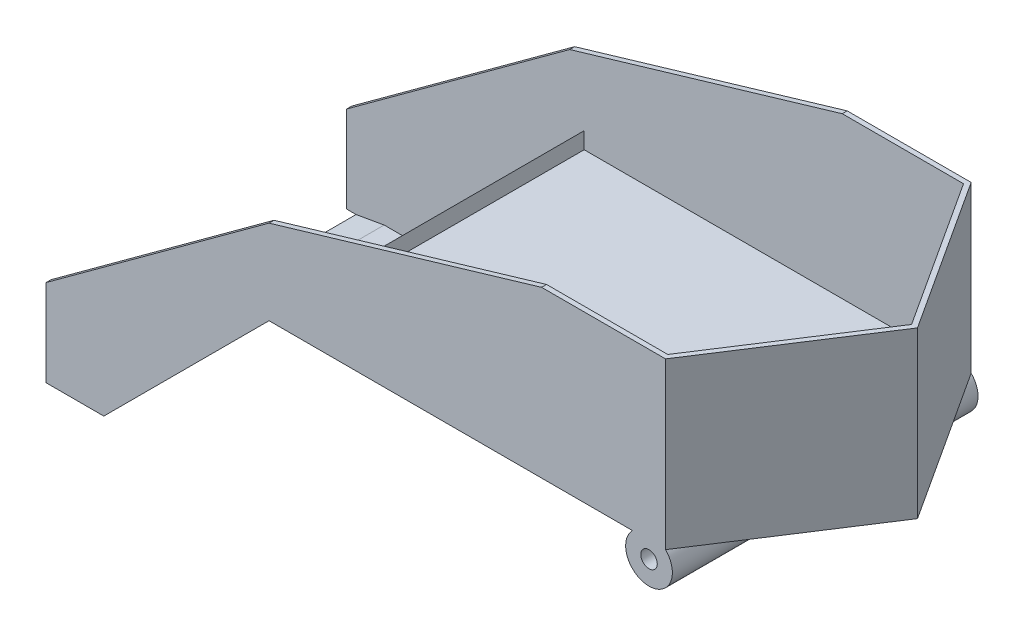
ISO-10303-21;
HEADER;
FILE_DESCRIPTION(('STEP AP214'),'2;1');
FILE_NAME('part.step','',(''),(''),'','','');
FILE_SCHEMA(('AUTOMOTIVE_DESIGN { 1 0 10303 214 1 1 1 1 }'));
ENDSEC;
DATA;
#1=APPLICATION_CONTEXT('core data for automotive mechanical design processes');
#2=APPLICATION_PROTOCOL_DEFINITION('international standard','automotive_design',2000,#1);
#3=PRODUCT_CONTEXT('',#1,'mechanical');
#4=PRODUCT('Part','Part','',(#3));
#5=PRODUCT_RELATED_PRODUCT_CATEGORY('part','',(#4));
#6=PRODUCT_DEFINITION_FORMATION('','',#4);
#7=PRODUCT_DEFINITION_CONTEXT('part definition',#1,'design');
#8=PRODUCT_DEFINITION('design','',#6,#7);
#9=PRODUCT_DEFINITION_SHAPE('','',#8);
#10=(LENGTH_UNIT() NAMED_UNIT(*) SI_UNIT(.MILLI.,.METRE.));
#11=(NAMED_UNIT(*) PLANE_ANGLE_UNIT() SI_UNIT($,.RADIAN.));
#12=(NAMED_UNIT(*) SI_UNIT($,.STERADIAN.) SOLID_ANGLE_UNIT());
#13=UNCERTAINTY_MEASURE_WITH_UNIT(LENGTH_MEASURE(1.E-05),#10,'distance_accuracy_value','');
#14=(GEOMETRIC_REPRESENTATION_CONTEXT(3) GLOBAL_UNCERTAINTY_ASSIGNED_CONTEXT((#13)) GLOBAL_UNIT_ASSIGNED_CONTEXT((#10,
#11,#12)) REPRESENTATION_CONTEXT('',''));
#15=CARTESIAN_POINT('',(0.,0.,0.));
#16=DIRECTION('',(0.,0.,1.));
#17=DIRECTION('',(1.,0.,0.));
#18=AXIS2_PLACEMENT_3D('',#15,#16,#17);
#19=CARTESIAN_POINT('',(0.,100.,-3.));
#20=DIRECTION('',(0.,0.,-1.));
#21=DIRECTION('',(-1.,0.,0.));
#22=AXIS2_PLACEMENT_3D('',#19,#20,#21);
#23=PLANE('',#22);
#24=DIRECTION('',(0.,-1.,0.));
#25=VECTOR('',#24,1.);
#26=CARTESIAN_POINT('',(8.75735931288072,13.,-3.));
#27=LINE('',#26,#25);
#28=CARTESIAN_POINT('',(8.75735931288072,13.,-3.));
#29=VERTEX_POINT('',#28);
#30=CARTESIAN_POINT('',(8.75735931288073,3.,-3.));
#31=VERTEX_POINT('',#30);
#32=EDGE_CURVE('E200',#29,#31,#27,.T.);
#33=ORIENTED_EDGE('',*,*,#32,.F.);
#34=DIRECTION('',(0.707106781186546,0.707106781186549,0.));
#35=VECTOR('',#34,1.);
#36=CARTESIAN_POINT('',(-102.121320343559,-97.8786796564404,-3.));
#37=LINE('',#36,#35);
#38=CARTESIAN_POINT('',(-101.242640687119,-97.,-3.));
#39=VERTEX_POINT('',#38);
#40=EDGE_CURVE('E57',#39,#29,#37,.T.);
#41=ORIENTED_EDGE('',*,*,#40,.F.);
#42=DIRECTION('',(1.,0.,0.));
#43=VECTOR('',#42,1.);
#44=CARTESIAN_POINT('',(-135.,-97.,-3.));
#45=LINE('',#44,#43);
#46=CARTESIAN_POINT('',(-112.314872721528,-97.,-3.));
#47=VERTEX_POINT('',#46);
#48=EDGE_CURVE('E298',#47,#39,#45,.T.);
#49=ORIENTED_EDGE('',*,*,#48,.F.);
#50=DIRECTION('',(-0.984807753012209,-0.173648177666928,0.));
#51=VECTOR('',#50,1.);
#52=CARTESIAN_POINT('',(-112.314872721528,-97.,-2.99999999999995));
#53=LINE('',#52,#51);
#54=CARTESIAN_POINT('',(-129.328718180381,-100.,-3.));
#55=VERTEX_POINT('',#54);
#56=EDGE_CURVE('E50',#47,#55,#53,.T.);
#57=ORIENTED_EDGE('',*,*,#56,.T.);
#58=DIRECTION('',(1.,0.,0.));
#59=VECTOR('',#58,1.);
#60=CARTESIAN_POINT('',(-135.,-100.,-3.));
#61=LINE('',#60,#59);
#62=CARTESIAN_POINT('',(-135.,-100.,-3.00000000000011));
#63=VERTEX_POINT('',#62);
#64=EDGE_CURVE('E294',#63,#55,#61,.T.);
#65=ORIENTED_EDGE('',*,*,#64,.F.);
#66=DIRECTION('',(0.,-1.,0.));
#67=VECTOR('',#66,1.);
#68=CARTESIAN_POINT('',(-135.,-47.5,-3.));
#69=LINE('',#68,#67);
#70=CARTESIAN_POINT('',(-135.,-47.5,-3.));
#71=VERTEX_POINT('',#70);
#72=EDGE_CURVE('E196',#71,#63,#69,.T.);
#73=ORIENTED_EDGE('',*,*,#72,.F.);
#74=DIRECTION('',(-0.807376516489411,-0.590036575664106,0.));
#75=VECTOR('',#74,1.);
#76=CARTESIAN_POINT('',(0.,51.1589727194508,-3.));
#77=LINE('',#76,#75);
#78=CARTESIAN_POINT('',(0.,51.1589727194508,-3.));
#79=VERTEX_POINT('',#78);
#80=EDGE_CURVE('E191',#79,#71,#77,.T.);
#81=ORIENTED_EDGE('',*,*,#80,.F.);
#82=DIRECTION('',(-0.958868255297712,-0.2838514910694,0.));
#83=VECTOR('',#82,1.);
#84=CARTESIAN_POINT('',(13.293364428122,55.0941758022557,-3.));
#85=LINE('',#84,#83);
#86=CARTESIAN_POINT('',(164.988073302028,100.,-3.));
#87=VERTEX_POINT('',#86);
#88=EDGE_CURVE('E193',#87,#79,#85,.T.);
#89=ORIENTED_EDGE('',*,*,#88,.F.);
#90=DIRECTION('',(1.,0.,0.));
#91=VECTOR('',#90,1.);
#92=CARTESIAN_POINT('',(0.,100.,-3.));
#93=LINE('',#92,#91);
#94=CARTESIAN_POINT('',(238.370095610076,100.,-3.));
#95=VERTEX_POINT('',#94);
#96=EDGE_CURVE('E244',#87,#95,#93,.T.);
#97=ORIENTED_EDGE('',*,*,#96,.T.);
#98=DIRECTION('',(0.,-1.,0.));
#99=VECTOR('',#98,1.);
#100=CARTESIAN_POINT('',(238.370095610076,100.,-3.));
#101=LINE('',#100,#99);
#102=CARTESIAN_POINT('',(238.370095610076,3.,-3.));
#103=VERTEX_POINT('',#102);
#104=EDGE_CURVE('E227',#95,#103,#101,.T.);
#105=ORIENTED_EDGE('',*,*,#104,.T.);
#106=DIRECTION('',(1.,0.,0.));
#107=VECTOR('',#106,1.);
#108=CARTESIAN_POINT('',(0.,3.,-3.));
#109=LINE('',#108,#107);
#110=EDGE_CURVE('E208',#31,#103,#109,.T.);
#111=ORIENTED_EDGE('',*,*,#110,.F.);
#112=EDGE_LOOP('',(#33,#41,#49,#57,#65,#73,#81,#89,#97,#105,#111));
#113=FACE_BOUND('',#112,.T.);
#114=ADVANCED_FACE('F41',(#113),#23,.T.);
#115=CARTESIAN_POINT('',(0.,100.,-182.));
#116=DIRECTION('',(0.,0.,1.));
#117=DIRECTION('',(1.,0.,0.));
#118=AXIS2_PLACEMENT_3D('',#115,#116,#117);
#119=PLANE('',#118);
#120=DIRECTION('',(-0.707106781186546,-0.707106781186549,0.));
#121=VECTOR('',#120,1.);
#122=CARTESIAN_POINT('',(-102.121320343559,-97.8786796564404,-182.));
#123=LINE('',#122,#121);
#124=CARTESIAN_POINT('',(8.75735931288072,13.,-182.));
#125=VERTEX_POINT('',#124);
#126=CARTESIAN_POINT('',(-101.242640687119,-97.,-182.));
#127=VERTEX_POINT('',#126);
#128=EDGE_CURVE('E65',#125,#127,#123,.T.);
#129=ORIENTED_EDGE('',*,*,#128,.F.);
#130=DIRECTION('',(0.,1.,0.));
#131=VECTOR('',#130,1.);
#132=CARTESIAN_POINT('',(8.75735931288072,13.,-182.));
#133=LINE('',#132,#131);
#134=CARTESIAN_POINT('',(8.75735931288073,3.,-182.));
#135=VERTEX_POINT('',#134);
#136=EDGE_CURVE('E421',#135,#125,#133,.T.);
#137=ORIENTED_EDGE('',*,*,#136,.F.);
#138=DIRECTION('',(-1.,0.,0.));
#139=VECTOR('',#138,1.);
#140=CARTESIAN_POINT('',(0.,3.,-182.));
#141=LINE('',#140,#139);
#142=CARTESIAN_POINT('',(238.370095610076,3.,-182.));
#143=VERTEX_POINT('',#142);
#144=EDGE_CURVE('E238',#143,#135,#141,.T.);
#145=ORIENTED_EDGE('',*,*,#144,.F.);
#146=DIRECTION('',(0.,-1.,0.));
#147=VECTOR('',#146,1.);
#148=CARTESIAN_POINT('',(238.370095610076,100.,-182.));
#149=LINE('',#148,#147);
#150=CARTESIAN_POINT('',(238.370095610076,100.,-182.));
#151=VERTEX_POINT('',#150);
#152=EDGE_CURVE('E236',#151,#143,#149,.T.);
#153=ORIENTED_EDGE('',*,*,#152,.F.);
#154=DIRECTION('',(-1.,0.,0.));
#155=VECTOR('',#154,1.);
#156=CARTESIAN_POINT('',(0.,100.,-182.));
#157=LINE('',#156,#155);
#158=CARTESIAN_POINT('',(164.988073302028,100.,-182.));
#159=VERTEX_POINT('',#158);
#160=EDGE_CURVE('E241',#151,#159,#157,.T.);
#161=ORIENTED_EDGE('',*,*,#160,.T.);
#162=DIRECTION('',(0.958868255297712,0.2838514910694,0.));
#163=VECTOR('',#162,1.);
#164=CARTESIAN_POINT('',(13.293364428122,55.0941758022557,-182.));
#165=LINE('',#164,#163);
#166=CARTESIAN_POINT('',(0.,51.1589727194508,-182.));
#167=VERTEX_POINT('',#166);
#168=EDGE_CURVE('E283',#167,#159,#165,.T.);
#169=ORIENTED_EDGE('',*,*,#168,.F.);
#170=DIRECTION('',(0.807376516489411,0.590036575664106,0.));
#171=VECTOR('',#170,1.);
#172=CARTESIAN_POINT('',(0.,51.1589727194508,-182.));
#173=LINE('',#172,#171);
#174=CARTESIAN_POINT('',(-135.,-47.5,-182.));
#175=VERTEX_POINT('',#174);
#176=EDGE_CURVE('E316',#175,#167,#173,.T.);
#177=ORIENTED_EDGE('',*,*,#176,.F.);
#178=DIRECTION('',(0.,1.,0.));
#179=VECTOR('',#178,1.);
#180=CARTESIAN_POINT('',(-135.,-47.5,-182.));
#181=LINE('',#180,#179);
#182=CARTESIAN_POINT('',(-135.,-100.,-182.));
#183=VERTEX_POINT('',#182);
#184=EDGE_CURVE('E314',#183,#175,#181,.T.);
#185=ORIENTED_EDGE('',*,*,#184,.F.);
#186=DIRECTION('',(-1.,0.,0.));
#187=VECTOR('',#186,1.);
#188=CARTESIAN_POINT('',(-135.,-100.,-182.));
#189=LINE('',#188,#187);
#190=CARTESIAN_POINT('',(-129.328718180381,-100.,-182.));
#191=VERTEX_POINT('',#190);
#192=EDGE_CURVE('E291',#191,#183,#189,.T.);
#193=ORIENTED_EDGE('',*,*,#192,.F.);
#194=DIRECTION('',(0.984807753012209,0.173648177666928,0.));
#195=VECTOR('',#194,1.);
#196=CARTESIAN_POINT('',(-112.314872721528,-97.,-182.));
#197=LINE('',#196,#195);
#198=CARTESIAN_POINT('',(-112.314872721528,-97.,-182.));
#199=VERTEX_POINT('',#198);
#200=EDGE_CURVE('E11',#191,#199,#197,.T.);
#201=ORIENTED_EDGE('',*,*,#200,.T.);
#202=DIRECTION('',(-1.,0.,0.));
#203=VECTOR('',#202,1.);
#204=CARTESIAN_POINT('',(-135.,-97.,-182.));
#205=LINE('',#204,#203);
#206=EDGE_CURVE('E309',#127,#199,#205,.T.);
#207=ORIENTED_EDGE('',*,*,#206,.F.);
#208=EDGE_LOOP('',(#129,#137,#145,#153,#161,#169,#177,#185,#193,#201,#207));
#209=FACE_BOUND('',#208,.T.);
#210=ADVANCED_FACE('F308',(#209),#119,.T.);
#211=CARTESIAN_POINT('',(0.,3.,0.));
#212=DIRECTION('',(0.,-1.,0.));
#213=DIRECTION('',(0.,0.,-1.));
#214=AXIS2_PLACEMENT_3D('',#211,#212,#213);
#215=PLANE('',#214);
#216=DIRECTION('',(0.,0.,-1.));
#217=VECTOR('',#216,1.);
#218=CARTESIAN_POINT('',(8.75735931288073,3.,11.1421356237309));
#219=LINE('',#218,#217);
#220=EDGE_CURVE('E416',#31,#135,#219,.T.);
#221=ORIENTED_EDGE('',*,*,#220,.F.);
#222=ORIENTED_EDGE('',*,*,#110,.T.);
#223=DIRECTION('',(0.544191105099022,0.,-0.838961287027659));
#224=VECTOR('',#223,1.);
#225=CARTESIAN_POINT('',(166.408566010382,3.,107.940691466194));
#226=LINE('',#225,#224);
#227=CARTESIAN_POINT('',(296.42414966413,3.,-92.5));
#228=VERTEX_POINT('',#227);
#229=EDGE_CURVE('E226',#103,#228,#226,.T.);
#230=ORIENTED_EDGE('',*,*,#229,.T.);
#231=DIRECTION('',(-0.544191105099022,0.,-0.838961287027659));
#232=VECTOR('',#231,1.);
#233=CARTESIAN_POINT('',(250.871290946115,3.,-162.727323856939));
#234=LINE('',#233,#232);
#235=EDGE_CURVE('E233',#228,#143,#234,.T.);
#236=ORIENTED_EDGE('',*,*,#235,.T.);
#237=ORIENTED_EDGE('',*,*,#144,.T.);
#238=EDGE_LOOP('',(#221,#222,#230,#236,#237));
#239=FACE_BOUND('',#238,.T.);
#240=ADVANCED_FACE('F425',(#239),#215,.F.);
#241=CARTESIAN_POINT('',(-135.,-47.5,-387.667301342865));
#242=DIRECTION('',(-1.,0.,0.));
#243=DIRECTION('',(0.,-1.,0.));
#244=AXIS2_PLACEMENT_3D('',#241,#242,#243);
#245=PLANE('',#244);
#246=ORIENTED_EDGE('',*,*,#72,.T.);
#247=DIRECTION('',(0.,0.,1.));
#248=VECTOR('',#247,1.);
#249=CARTESIAN_POINT('',(-135.,-100.,-387.667301342865));
#250=LINE('',#249,#248);
#251=CARTESIAN_POINT('',(-135.,-100.,0.));
#252=VERTEX_POINT('',#251);
#253=EDGE_CURVE('E306',#63,#252,#250,.T.);
#254=ORIENTED_EDGE('',*,*,#253,.T.);
#255=DIRECTION('',(0.,-1.,0.));
#256=VECTOR('',#255,1.);
#257=CARTESIAN_POINT('',(-135.,-47.5,0.));
#258=LINE('',#257,#256);
#259=CARTESIAN_POINT('',(-135.,-47.5,0.));
#260=VERTEX_POINT('',#259);
#261=EDGE_CURVE('E334',#260,#252,#258,.T.);
#262=ORIENTED_EDGE('',*,*,#261,.F.);
#263=DIRECTION('',(0.,0.,1.));
#264=VECTOR('',#263,1.);
#265=CARTESIAN_POINT('',(-135.,-47.5,-387.667301342865));
#266=LINE('',#265,#264);
#267=EDGE_CURVE('E343',#71,#260,#266,.T.);
#268=ORIENTED_EDGE('',*,*,#267,.F.);
#269=EDGE_LOOP('',(#246,#254,#262,#268));
#270=FACE_BOUND('',#269,.T.);
#271=ADVANCED_FACE('F427',(#270),#245,.T.);
#272=CARTESIAN_POINT('',(0.,51.1589727194508,-387.667301342865));
#273=DIRECTION('',(-0.590036575664106,0.807376516489411,0.));
#274=DIRECTION('',(-0.807376516489411,-0.590036575664106,0.));
#275=AXIS2_PLACEMENT_3D('',#272,#273,#274);
#276=PLANE('',#275);
#277=ORIENTED_EDGE('',*,*,#176,.T.);
#278=DIRECTION('',(0.,0.,1.));
#279=VECTOR('',#278,1.);
#280=CARTESIAN_POINT('',(0.,51.1589727194508,-185.));
#281=LINE('',#280,#279);
#282=CARTESIAN_POINT('',(0.,51.1589727194508,-185.));
#283=VERTEX_POINT('',#282);
#284=EDGE_CURVE('E215',#283,#167,#281,.T.);
#285=ORIENTED_EDGE('',*,*,#284,.F.);
#286=DIRECTION('',(0.807376516489411,0.590036575664106,0.));
#287=VECTOR('',#286,1.);
#288=CARTESIAN_POINT('',(0.,51.1589727194508,-185.));
#289=LINE('',#288,#287);
#290=CARTESIAN_POINT('',(-135.,-47.5,-185.));
#291=VERTEX_POINT('',#290);
#292=EDGE_CURVE('E332',#291,#283,#289,.T.);
#293=ORIENTED_EDGE('',*,*,#292,.F.);
#294=EDGE_CURVE('E348',#291,#175,#266,.T.);
#295=ORIENTED_EDGE('',*,*,#294,.T.);
#296=EDGE_LOOP('',(#277,#285,#293,#295));
#297=FACE_BOUND('',#296,.T.);
#298=ADVANCED_FACE('F434',(#297),#276,.T.);
#299=CARTESIAN_POINT('',(-135.,-100.,-185.));
#300=VERTEX_POINT('',#299);
#301=EDGE_CURVE('E345',#300,#183,#250,.T.);
#302=ORIENTED_EDGE('',*,*,#301,.T.);
#303=ORIENTED_EDGE('',*,*,#184,.T.);
#304=ORIENTED_EDGE('',*,*,#294,.F.);
#305=DIRECTION('',(0.,1.,0.));
#306=VECTOR('',#305,1.);
#307=CARTESIAN_POINT('',(-135.,-47.5,-185.));
#308=LINE('',#307,#306);
#309=EDGE_CURVE('E325',#300,#291,#308,.T.);
#310=ORIENTED_EDGE('',*,*,#309,.F.);
#311=EDGE_LOOP('',(#302,#303,#304,#310));
#312=FACE_BOUND('',#311,.T.);
#313=ADVANCED_FACE('F437',(#312),#245,.T.);
#314=CARTESIAN_POINT('',(0.,51.1589727194508,0.));
#315=VERTEX_POINT('',#314);
#316=EDGE_CURVE('E204',#79,#315,#281,.T.);
#317=ORIENTED_EDGE('',*,*,#316,.F.);
#318=ORIENTED_EDGE('',*,*,#80,.T.);
#319=ORIENTED_EDGE('',*,*,#267,.T.);
#320=DIRECTION('',(-0.807376516489411,-0.590036575664106,0.));
#321=VECTOR('',#320,1.);
#322=CARTESIAN_POINT('',(0.,51.1589727194508,0.));
#323=LINE('',#322,#321);
#324=EDGE_CURVE('E214',#315,#260,#323,.T.);
#325=ORIENTED_EDGE('',*,*,#324,.F.);
#326=EDGE_LOOP('',(#317,#318,#319,#325));
#327=FACE_BOUND('',#326,.T.);
#328=ADVANCED_FACE('F212',(#327),#276,.T.);
#329=CARTESIAN_POINT('',(0.,0.,0.));
#330=DIRECTION('',(0.,-1.,0.));
#331=DIRECTION('',(0.,0.,-1.));
#332=AXIS2_PLACEMENT_3D('',#329,#330,#331);
#333=PLANE('',#332);
#334=DIRECTION('',(0.,0.,1.));
#335=VECTOR('',#334,1.);
#336=CARTESIAN_POINT('',(240.,0.,-222.18659318188));
#337=LINE('',#336,#335);
#338=CARTESIAN_POINT('',(240.,0.,-185.));
#339=VERTEX_POINT('',#338);
#340=CARTESIAN_POINT('',(240.,0.,0.));
#341=VERTEX_POINT('',#340);
#342=EDGE_CURVE('E364',#339,#341,#337,.T.);
#343=ORIENTED_EDGE('',*,*,#342,.F.);
#344=DIRECTION('',(-0.544191105099022,0.,-0.838961287027659));
#345=VECTOR('',#344,1.);
#346=CARTESIAN_POINT('',(240.,0.,-185.));
#347=LINE('',#346,#345);
#348=CARTESIAN_POINT('',(300.,0.,-92.5));
#349=VERTEX_POINT('',#348);
#350=EDGE_CURVE('E271',#349,#339,#347,.T.);
#351=ORIENTED_EDGE('',*,*,#350,.F.);
#352=DIRECTION('',(0.544191105099022,0.,-0.838961287027659));
#353=VECTOR('',#352,1.);
#354=CARTESIAN_POINT('',(300.,0.,-92.5));
#355=LINE('',#354,#353);
#356=EDGE_CURVE('E269',#341,#349,#355,.T.);
#357=ORIENTED_EDGE('',*,*,#356,.F.);
#358=EDGE_LOOP('',(#343,#351,#357));
#359=FACE_BOUND('',#358,.T.);
#360=ADVANCED_FACE('F474',(#359),#333,.T.);
#361=CARTESIAN_POINT('',(0.,100.,0.));
#362=DIRECTION('',(0.,-1.,0.));
#363=DIRECTION('',(0.,0.,-1.));
#364=AXIS2_PLACEMENT_3D('',#361,#362,#363);
#365=PLANE('',#364);
#366=DIRECTION('',(-1.,0.,0.));
#367=VECTOR('',#366,1.);
#368=CARTESIAN_POINT('',(0.,100.,-185.));
#369=LINE('',#368,#367);
#370=CARTESIAN_POINT('',(240.,100.,-185.));
#371=VERTEX_POINT('',#370);
#372=CARTESIAN_POINT('',(164.988073302028,100.,-185.));
#373=VERTEX_POINT('',#372);
#374=EDGE_CURVE('E260',#371,#373,#369,.T.);
#375=ORIENTED_EDGE('',*,*,#374,.T.);
#376=DIRECTION('',(0.,0.,1.));
#377=VECTOR('',#376,1.);
#378=CARTESIAN_POINT('',(164.988073302028,100.,-185.));
#379=LINE('',#378,#377);
#380=EDGE_CURVE('E209',#373,#159,#379,.T.);
#381=ORIENTED_EDGE('',*,*,#380,.T.);
#382=ORIENTED_EDGE('',*,*,#160,.F.);
#383=DIRECTION('',(-0.544191105099022,0.,-0.838961287027659));
#384=VECTOR('',#383,1.);
#385=CARTESIAN_POINT('',(250.871290946115,100.,-162.727323856939));
#386=LINE('',#385,#384);
#387=CARTESIAN_POINT('',(296.42414966413,100.,-92.5));
#388=VERTEX_POINT('',#387);
#389=EDGE_CURVE('E248',#388,#151,#386,.T.);
#390=ORIENTED_EDGE('',*,*,#389,.F.);
#391=DIRECTION('',(0.544191105099022,0.,-0.838961287027659));
#392=VECTOR('',#391,1.);
#393=CARTESIAN_POINT('',(166.408566010382,100.,107.940691466194));
#394=LINE('',#393,#392);
#395=EDGE_CURVE('E246',#95,#388,#394,.T.);
#396=ORIENTED_EDGE('',*,*,#395,.F.);
#397=ORIENTED_EDGE('',*,*,#96,.F.);
#398=CARTESIAN_POINT('',(164.988073302028,100.,0.));
#399=VERTEX_POINT('',#398);
#400=EDGE_CURVE('E207',#87,#399,#379,.T.);
#401=ORIENTED_EDGE('',*,*,#400,.T.);
#402=DIRECTION('',(1.,0.,0.));
#403=VECTOR('',#402,1.);
#404=CARTESIAN_POINT('',(0.,100.,0.));
#405=LINE('',#404,#403);
#406=CARTESIAN_POINT('',(240.,100.,0.));
#407=VERTEX_POINT('',#406);
#408=EDGE_CURVE('E253',#399,#407,#405,.T.);
#409=ORIENTED_EDGE('',*,*,#408,.T.);
#410=DIRECTION('',(0.544191105099022,0.,-0.838961287027659));
#411=VECTOR('',#410,1.);
#412=CARTESIAN_POINT('',(300.,100.,-92.5));
#413=LINE('',#412,#411);
#414=CARTESIAN_POINT('',(300.,100.,-92.5));
#415=VERTEX_POINT('',#414);
#416=EDGE_CURVE('E255',#407,#415,#413,.T.);
#417=ORIENTED_EDGE('',*,*,#416,.T.);
#418=DIRECTION('',(-0.544191105099022,0.,-0.838961287027659));
#419=VECTOR('',#418,1.);
#420=CARTESIAN_POINT('',(240.,100.,-185.));
#421=LINE('',#420,#419);
#422=EDGE_CURVE('E258',#415,#371,#421,.T.);
#423=ORIENTED_EDGE('',*,*,#422,.T.);
#424=EDGE_LOOP('',(#375,#381,#382,#390,#396,#397,#401,#409,#417,#423));
#425=FACE_BOUND('',#424,.T.);
#426=ADVANCED_FACE('F372',(#425),#365,.F.);
#427=CARTESIAN_POINT('',(0.,100.,0.));
#428=DIRECTION('',(0.,0.,-1.));
#429=DIRECTION('',(-1.,0.,0.));
#430=AXIS2_PLACEMENT_3D('',#427,#428,#429);
#431=PLANE('',#430);
#432=ORIENTED_EDGE('',*,*,#408,.F.);
#433=DIRECTION('',(0.958868255297712,0.2838514910694,0.));
#434=VECTOR('',#433,1.);
#435=CARTESIAN_POINT('',(0.,51.1589727194508,0.));
#436=LINE('',#435,#434);
#437=EDGE_CURVE('E220',#315,#399,#436,.T.);
#438=ORIENTED_EDGE('',*,*,#437,.F.);
#439=ORIENTED_EDGE('',*,*,#324,.T.);
#440=ORIENTED_EDGE('',*,*,#261,.T.);
#441=DIRECTION('',(1.,0.,0.));
#442=VECTOR('',#441,1.);
#443=CARTESIAN_POINT('',(-135.,-100.,0.));
#444=LINE('',#443,#442);
#445=CARTESIAN_POINT('',(-99.9999999999996,-100.,0.));
#446=VERTEX_POINT('',#445);
#447=EDGE_CURVE('E337',#252,#446,#444,.T.);
#448=ORIENTED_EDGE('',*,*,#447,.T.);
#449=DIRECTION('',(0.707106781186546,0.707106781186549,0.));
#450=VECTOR('',#449,1.);
#451=CARTESIAN_POINT('',(-99.9999999999996,-100.,0.));
#452=LINE('',#451,#450);
#453=CARTESIAN_POINT('',(0.,0.,0.));
#454=VERTEX_POINT('',#453);
#455=EDGE_CURVE('E340',#446,#454,#452,.T.);
#456=ORIENTED_EDGE('',*,*,#455,.T.);
#457=DIRECTION('',(1.,0.,0.));
#458=VECTOR('',#457,1.);
#459=CARTESIAN_POINT('',(0.,0.,0.));
#460=LINE('',#459,#458);
#461=CARTESIAN_POINT('',(220.,0.,0.));
#462=VERTEX_POINT('',#461);
#463=EDGE_CURVE('E266',#454,#462,#460,.T.);
#464=ORIENTED_EDGE('',*,*,#463,.T.);
#465=CARTESIAN_POINT('',(230.,-9.99999999999999,0.));
#466=DIRECTION('',(0.,0.,1.));
#467=DIRECTION('',(-1.,0.,0.));
#468=AXIS2_PLACEMENT_3D('',#465,#466,#467);
#469=CIRCLE('',#468,14.142135623731);
#470=EDGE_CURVE('E361',#462,#341,#469,.T.);
#471=ORIENTED_EDGE('',*,*,#470,.T.);
#472=DIRECTION('',(0.,-1.,0.));
#473=VECTOR('',#472,1.);
#474=CARTESIAN_POINT('',(240.,100.,0.));
#475=LINE('',#474,#473);
#476=EDGE_CURVE('E280',#407,#341,#475,.T.);
#477=ORIENTED_EDGE('',*,*,#476,.F.);
#478=EDGE_LOOP('',(#432,#438,#439,#440,#448,#456,#464,#471,#477));
#479=FACE_BOUND('',#478,.T.);
#480=CARTESIAN_POINT('',(230.,-9.99999999999999,0.));
#481=DIRECTION('',(0.,0.,1.));
#482=DIRECTION('',(1.,0.,0.));
#483=AXIS2_PLACEMENT_3D('',#480,#481,#482);
#484=CIRCLE('',#483,4.99999999999999);
#485=CARTESIAN_POINT('',(235.,-9.99999999999999,0.));
#486=VERTEX_POINT('',#485);
#487=EDGE_CURVE('E353',#486,#486,#484,.T.);
#488=ORIENTED_EDGE('',*,*,#487,.F.);
#489=EDGE_LOOP('',(#488));
#490=FACE_BOUND('',#489,.T.);
#491=ADVANCED_FACE('F375',(#479,#490),#431,.F.);
#492=CARTESIAN_POINT('',(300.,100.,-92.5));
#493=DIRECTION('',(-0.838961287027659,0.,-0.544191105099022));
#494=DIRECTION('',(-0.544191105099022,0.,0.838961287027659));
#495=AXIS2_PLACEMENT_3D('',#492,#493,#494);
#496=PLANE('',#495);
#497=ORIENTED_EDGE('',*,*,#356,.T.);
#498=DIRECTION('',(0.,-1.,0.));
#499=VECTOR('',#498,1.);
#500=CARTESIAN_POINT('',(300.,100.,-92.5));
#501=LINE('',#500,#499);
#502=EDGE_CURVE('E277',#415,#349,#501,.T.);
#503=ORIENTED_EDGE('',*,*,#502,.F.);
#504=ORIENTED_EDGE('',*,*,#416,.F.);
#505=ORIENTED_EDGE('',*,*,#476,.T.);
#506=EDGE_LOOP('',(#497,#503,#504,#505));
#507=FACE_BOUND('',#506,.T.);
#508=ADVANCED_FACE('F381',(#507),#496,.F.);
#509=CARTESIAN_POINT('',(240.,100.,-185.));
#510=DIRECTION('',(-0.838961287027659,0.,0.544191105099022));
#511=DIRECTION('',(0.544191105099022,0.,0.838961287027659));
#512=AXIS2_PLACEMENT_3D('',#509,#510,#511);
#513=PLANE('',#512);
#514=ORIENTED_EDGE('',*,*,#350,.T.);
#515=DIRECTION('',(0.,-1.,0.));
#516=VECTOR('',#515,1.);
#517=CARTESIAN_POINT('',(240.,100.,-185.));
#518=LINE('',#517,#516);
#519=EDGE_CURVE('E263',#371,#339,#518,.T.);
#520=ORIENTED_EDGE('',*,*,#519,.F.);
#521=ORIENTED_EDGE('',*,*,#422,.F.);
#522=ORIENTED_EDGE('',*,*,#502,.T.);
#523=EDGE_LOOP('',(#514,#520,#521,#522));
#524=FACE_BOUND('',#523,.T.);
#525=ADVANCED_FACE('F387',(#524),#513,.F.);
#526=CARTESIAN_POINT('',(0.,100.,-185.));
#527=DIRECTION('',(0.,0.,1.));
#528=DIRECTION('',(1.,0.,0.));
#529=AXIS2_PLACEMENT_3D('',#526,#527,#528);
#530=PLANE('',#529);
#531=DIRECTION('',(-1.,0.,0.));
#532=VECTOR('',#531,1.);
#533=CARTESIAN_POINT('',(0.,0.,-185.));
#534=LINE('',#533,#532);
#535=CARTESIAN_POINT('',(220.,0.,-185.));
#536=VERTEX_POINT('',#535);
#537=CARTESIAN_POINT('',(0.,0.,-185.));
#538=VERTEX_POINT('',#537);
#539=EDGE_CURVE('E256',#536,#538,#534,.T.);
#540=ORIENTED_EDGE('',*,*,#539,.T.);
#541=DIRECTION('',(-0.707106781186546,-0.707106781186549,0.));
#542=VECTOR('',#541,1.);
#543=CARTESIAN_POINT('',(-99.9999999999996,-100.,-185.));
#544=LINE('',#543,#542);
#545=CARTESIAN_POINT('',(-99.9999999999996,-100.,-185.));
#546=VERTEX_POINT('',#545);
#547=EDGE_CURVE('E330',#538,#546,#544,.T.);
#548=ORIENTED_EDGE('',*,*,#547,.T.);
#549=DIRECTION('',(-1.,0.,0.));
#550=VECTOR('',#549,1.);
#551=CARTESIAN_POINT('',(-135.,-100.,-185.));
#552=LINE('',#551,#550);
#553=EDGE_CURVE('E327',#546,#300,#552,.T.);
#554=ORIENTED_EDGE('',*,*,#553,.T.);
#555=ORIENTED_EDGE('',*,*,#309,.T.);
#556=ORIENTED_EDGE('',*,*,#292,.T.);
#557=DIRECTION('',(0.958868255297712,0.2838514910694,0.));
#558=VECTOR('',#557,1.);
#559=CARTESIAN_POINT('',(0.,51.1589727194508,-185.));
#560=LINE('',#559,#558);
#561=EDGE_CURVE('E216',#283,#373,#560,.T.);
#562=ORIENTED_EDGE('',*,*,#561,.T.);
#563=ORIENTED_EDGE('',*,*,#374,.F.);
#564=ORIENTED_EDGE('',*,*,#519,.T.);
#565=CARTESIAN_POINT('',(230.,-9.99999999999999,-185.));
#566=DIRECTION('',(0.,0.,1.));
#567=DIRECTION('',(1.,0.,0.));
#568=AXIS2_PLACEMENT_3D('',#565,#566,#567);
#569=CIRCLE('',#568,14.142135623731);
#570=EDGE_CURVE('E354',#339,#536,#569,.F.);
#571=ORIENTED_EDGE('',*,*,#570,.T.);
#572=EDGE_LOOP('',(#540,#548,#554,#555,#556,#562,#563,#564,#571));
#573=FACE_BOUND('',#572,.T.);
#574=CARTESIAN_POINT('',(230.,-9.99999999999999,-185.));
#575=DIRECTION('',(0.,0.,1.));
#576=DIRECTION('',(1.,0.,0.));
#577=AXIS2_PLACEMENT_3D('',#574,#575,#576);
#578=CIRCLE('',#577,4.99999999999999);
#579=CARTESIAN_POINT('',(235.,-9.99999999999999,-185.));
#580=VERTEX_POINT('',#579);
#581=EDGE_CURVE('E357',#580,#580,#578,.F.);
#582=ORIENTED_EDGE('',*,*,#581,.F.);
#583=EDGE_LOOP('',(#582));
#584=FACE_BOUND('',#583,.T.);
#585=ADVANCED_FACE('F390',(#573,#584),#530,.F.);
#586=DIRECTION('',(0.,0.,1.));
#587=VECTOR('',#586,1.);
#588=CARTESIAN_POINT('',(220.,0.,-222.18659318188));
#589=LINE('',#588,#587);
#590=EDGE_CURVE('E358',#536,#462,#589,.T.);
#591=ORIENTED_EDGE('',*,*,#590,.T.);
#592=ORIENTED_EDGE('',*,*,#463,.F.);
#593=DIRECTION('',(0.,0.,1.));
#594=VECTOR('',#593,1.);
#595=CARTESIAN_POINT('',(0.,0.,0.));
#596=LINE('',#595,#594);
#597=EDGE_CURVE('E230',#538,#454,#596,.T.);
#598=ORIENTED_EDGE('',*,*,#597,.F.);
#599=ORIENTED_EDGE('',*,*,#539,.F.);
#600=EDGE_LOOP('',(#591,#592,#598,#599));
#601=FACE_BOUND('',#600,.T.);
#602=ADVANCED_FACE('F450',(#601),#333,.T.);
#603=CARTESIAN_POINT('',(297.483116138917,100.,-94.1325733152971));
#604=DIRECTION('',(-0.838961287027659,0.,-0.544191105099022));
#605=DIRECTION('',(-0.544191105099022,0.,0.838961287027659));
#606=AXIS2_PLACEMENT_3D('',#603,#604,#605);
#607=PLANE('',#606);
#608=ORIENTED_EDGE('',*,*,#229,.F.);
#609=ORIENTED_EDGE('',*,*,#104,.F.);
#610=ORIENTED_EDGE('',*,*,#395,.T.);
#611=DIRECTION('',(0.,-1.,0.));
#612=VECTOR('',#611,1.);
#613=CARTESIAN_POINT('',(296.42414966413,100.,-92.5));
#614=LINE('',#613,#612);
#615=EDGE_CURVE('E231',#388,#228,#614,.T.);
#616=ORIENTED_EDGE('',*,*,#615,.T.);
#617=EDGE_LOOP('',(#608,#609,#610,#616));
#618=FACE_BOUND('',#617,.T.);
#619=ADVANCED_FACE('F407',(#618),#607,.T.);
#620=CARTESIAN_POINT('',(237.483116138917,100.,-183.367426684703));
#621=DIRECTION('',(-0.838961287027659,0.,0.544191105099022));
#622=DIRECTION('',(0.544191105099022,0.,0.838961287027659));
#623=AXIS2_PLACEMENT_3D('',#620,#621,#622);
#624=PLANE('',#623);
#625=ORIENTED_EDGE('',*,*,#235,.F.);
#626=ORIENTED_EDGE('',*,*,#615,.F.);
#627=ORIENTED_EDGE('',*,*,#389,.T.);
#628=ORIENTED_EDGE('',*,*,#152,.T.);
#629=EDGE_LOOP('',(#625,#626,#627,#628));
#630=FACE_BOUND('',#629,.T.);
#631=ADVANCED_FACE('F403',(#630),#624,.T.);
#632=CARTESIAN_POINT('',(0.,51.1589727194508,-185.));
#633=DIRECTION('',(0.2838514910694,-0.958868255297712,0.));
#634=DIRECTION('',(0.958868255297712,0.2838514910694,0.));
#635=AXIS2_PLACEMENT_3D('',#632,#633,#634);
#636=PLANE('',#635);
#637=ORIENTED_EDGE('',*,*,#168,.T.);
#638=ORIENTED_EDGE('',*,*,#380,.F.);
#639=ORIENTED_EDGE('',*,*,#561,.F.);
#640=ORIENTED_EDGE('',*,*,#284,.T.);
#641=EDGE_LOOP('',(#637,#638,#639,#640));
#642=FACE_BOUND('',#641,.T.);
#643=ADVANCED_FACE('F395',(#642),#636,.F.);
#644=ORIENTED_EDGE('',*,*,#88,.T.);
#645=ORIENTED_EDGE('',*,*,#316,.T.);
#646=ORIENTED_EDGE('',*,*,#437,.T.);
#647=ORIENTED_EDGE('',*,*,#400,.F.);
#648=EDGE_LOOP('',(#644,#645,#646,#647));
#649=FACE_BOUND('',#648,.T.);
#650=ADVANCED_FACE('F203',(#649),#636,.F.);
#651=CARTESIAN_POINT('',(230.,-9.99999999999999,-222.18659318188));
#652=DIRECTION('',(0.,0.,1.));
#653=DIRECTION('',(1.,0.,0.));
#654=AXIS2_PLACEMENT_3D('',#651,#652,#653);
#655=CYLINDRICAL_SURFACE('',#654,14.142135623731);
#656=ORIENTED_EDGE('',*,*,#570,.F.);
#657=ORIENTED_EDGE('',*,*,#342,.T.);
#658=ORIENTED_EDGE('',*,*,#470,.F.);
#659=ORIENTED_EDGE('',*,*,#590,.F.);
#660=EDGE_LOOP('',(#656,#657,#658,#659));
#661=FACE_BOUND('',#660,.T.);
#662=ADVANCED_FACE('F460',(#661),#655,.T.);
#663=CARTESIAN_POINT('',(230.,-9.99999999999999,-222.18659318188));
#664=DIRECTION('',(0.,0.,1.));
#665=DIRECTION('',(1.,0.,0.));
#666=AXIS2_PLACEMENT_3D('',#663,#664,#665);
#667=CYLINDRICAL_SURFACE('',#666,4.99999999999999);
#668=ORIENTED_EDGE('',*,*,#581,.T.);
#669=EDGE_LOOP('',(#668));
#670=FACE_BOUND('',#669,.T.);
#671=ORIENTED_EDGE('',*,*,#487,.T.);
#672=EDGE_LOOP('',(#671));
#673=FACE_BOUND('',#672,.T.);
#674=ADVANCED_FACE('F464',(#670,#673),#667,.F.);
#675=CARTESIAN_POINT('',(-99.9999999999996,-100.,-387.667301342865));
#676=DIRECTION('',(0.707106781186549,-0.707106781186546,0.));
#677=DIRECTION('',(0.707106781186546,0.707106781186549,0.));
#678=AXIS2_PLACEMENT_3D('',#675,#676,#677);
#679=PLANE('',#678);
#680=ORIENTED_EDGE('',*,*,#547,.F.);
#681=ORIENTED_EDGE('',*,*,#597,.T.);
#682=ORIENTED_EDGE('',*,*,#455,.F.);
#683=DIRECTION('',(0.,0.,1.));
#684=VECTOR('',#683,1.);
#685=CARTESIAN_POINT('',(-99.9999999999996,-100.,-387.667301342865));
#686=LINE('',#685,#684);
#687=EDGE_CURVE('E328',#546,#446,#686,.T.);
#688=ORIENTED_EDGE('',*,*,#687,.F.);
#689=EDGE_LOOP('',(#680,#681,#682,#688));
#690=FACE_BOUND('',#689,.T.);
#691=ADVANCED_FACE('F470',(#690),#679,.T.);
#692=CARTESIAN_POINT('',(-135.,-100.,-387.667301342865));
#693=DIRECTION('',(0.,-1.,0.));
#694=DIRECTION('',(1.,0.,0.));
#695=AXIS2_PLACEMENT_3D('',#692,#693,#694);
#696=PLANE('',#695);
#697=ORIENTED_EDGE('',*,*,#253,.F.);
#698=ORIENTED_EDGE('',*,*,#64,.T.);
#699=DIRECTION('',(0.,0.,-1.));
#700=VECTOR('',#699,1.);
#701=CARTESIAN_POINT('',(-129.328718180381,-100.,-387.667301342865));
#702=LINE('',#701,#700);
#703=EDGE_CURVE('E288',#55,#191,#702,.T.);
#704=ORIENTED_EDGE('',*,*,#703,.T.);
#705=ORIENTED_EDGE('',*,*,#192,.T.);
#706=ORIENTED_EDGE('',*,*,#301,.F.);
#707=ORIENTED_EDGE('',*,*,#553,.F.);
#708=ORIENTED_EDGE('',*,*,#687,.T.);
#709=ORIENTED_EDGE('',*,*,#447,.F.);
#710=EDGE_LOOP('',(#697,#698,#704,#705,#706,#707,#708,#709));
#711=FACE_BOUND('',#710,.T.);
#712=ADVANCED_FACE('F303',(#711),#696,.T.);
#713=CARTESIAN_POINT('',(-102.121320343559,-97.8786796564404,-387.667301342865));
#714=DIRECTION('',(0.707106781186549,-0.707106781186546,0.));
#715=DIRECTION('',(0.707106781186546,0.707106781186549,0.));
#716=AXIS2_PLACEMENT_3D('',#713,#714,#715);
#717=PLANE('',#716);
#718=ORIENTED_EDGE('',*,*,#128,.T.);
#719=DIRECTION('',(0.,0.,1.));
#720=VECTOR('',#719,1.);
#721=CARTESIAN_POINT('',(-101.242640687119,-97.,-387.667301342865));
#722=LINE('',#721,#720);
#723=EDGE_CURVE('E313',#127,#39,#722,.T.);
#724=ORIENTED_EDGE('',*,*,#723,.T.);
#725=ORIENTED_EDGE('',*,*,#40,.T.);
#726=DIRECTION('',(0.,0.,-1.));
#727=VECTOR('',#726,1.);
#728=CARTESIAN_POINT('',(8.75735931288072,13.,11.1421356237309));
#729=LINE('',#728,#727);
#730=EDGE_CURVE('E417',#29,#125,#729,.T.);
#731=ORIENTED_EDGE('',*,*,#730,.T.);
#732=EDGE_LOOP('',(#718,#724,#725,#731));
#733=FACE_BOUND('',#732,.T.);
#734=ADVANCED_FACE('F424',(#733),#717,.F.);
#735=CARTESIAN_POINT('',(-135.,-97.,-387.667301342865));
#736=DIRECTION('',(0.,-1.,0.));
#737=DIRECTION('',(1.,0.,0.));
#738=AXIS2_PLACEMENT_3D('',#735,#736,#737);
#739=PLANE('',#738);
#740=ORIENTED_EDGE('',*,*,#206,.T.);
#741=DIRECTION('',(0.,0.,1.));
#742=VECTOR('',#741,1.);
#743=CARTESIAN_POINT('',(-112.314872721528,-97.,-3.));
#744=LINE('',#743,#742);
#745=EDGE_CURVE('E285',#199,#47,#744,.T.);
#746=ORIENTED_EDGE('',*,*,#745,.T.);
#747=ORIENTED_EDGE('',*,*,#48,.T.);
#748=ORIENTED_EDGE('',*,*,#723,.F.);
#749=EDGE_LOOP('',(#740,#746,#747,#748));
#750=FACE_BOUND('',#749,.T.);
#751=ADVANCED_FACE('F312',(#750),#739,.F.);
#752=CARTESIAN_POINT('',(-112.314872721528,-97.,-387.667301342865));
#753=DIRECTION('',(-0.173648177666928,0.984807753012208,0.));
#754=DIRECTION('',(0.,0.,-1.));
#755=AXIS2_PLACEMENT_3D('',#752,#753,#754);
#756=PLANE('',#755);
#757=ORIENTED_EDGE('',*,*,#200,.F.);
#758=ORIENTED_EDGE('',*,*,#703,.F.);
#759=ORIENTED_EDGE('',*,*,#56,.F.);
#760=ORIENTED_EDGE('',*,*,#745,.F.);
#761=EDGE_LOOP('',(#757,#758,#759,#760));
#762=FACE_BOUND('',#761,.T.);
#763=ADVANCED_FACE('F44',(#762),#756,.T.);
#764=CARTESIAN_POINT('',(8.75735931288072,13.,11.1421356237309));
#765=DIRECTION('',(-1.,0.,0.));
#766=DIRECTION('',(0.,-1.,0.));
#767=AXIS2_PLACEMENT_3D('',#764,#765,#766);
#768=PLANE('',#767);
#769=ORIENTED_EDGE('',*,*,#730,.F.);
#770=ORIENTED_EDGE('',*,*,#32,.T.);
#771=ORIENTED_EDGE('',*,*,#220,.T.);
#772=ORIENTED_EDGE('',*,*,#136,.T.);
#773=EDGE_LOOP('',(#769,#770,#771,#772));
#774=FACE_BOUND('',#773,.T.);
#775=ADVANCED_FACE('F414',(#774),#768,.F.);
#776=CLOSED_SHELL('',(#114,#210,#240,#271,#298,#313,#328,#360,#426,#491,#508,#525,#585,#602,
#619,#631,#643,#650,#662,#674,#691,#712,#734,#751,#763,#775));
#777=MANIFOLD_SOLID_BREP('B2',#776);
#778=ADVANCED_BREP_SHAPE_REPRESENTATION('',(#18,#777),#14);
#779=SHAPE_DEFINITION_REPRESENTATION(#9,#778);
ENDSEC;
END-ISO-10303-21;
